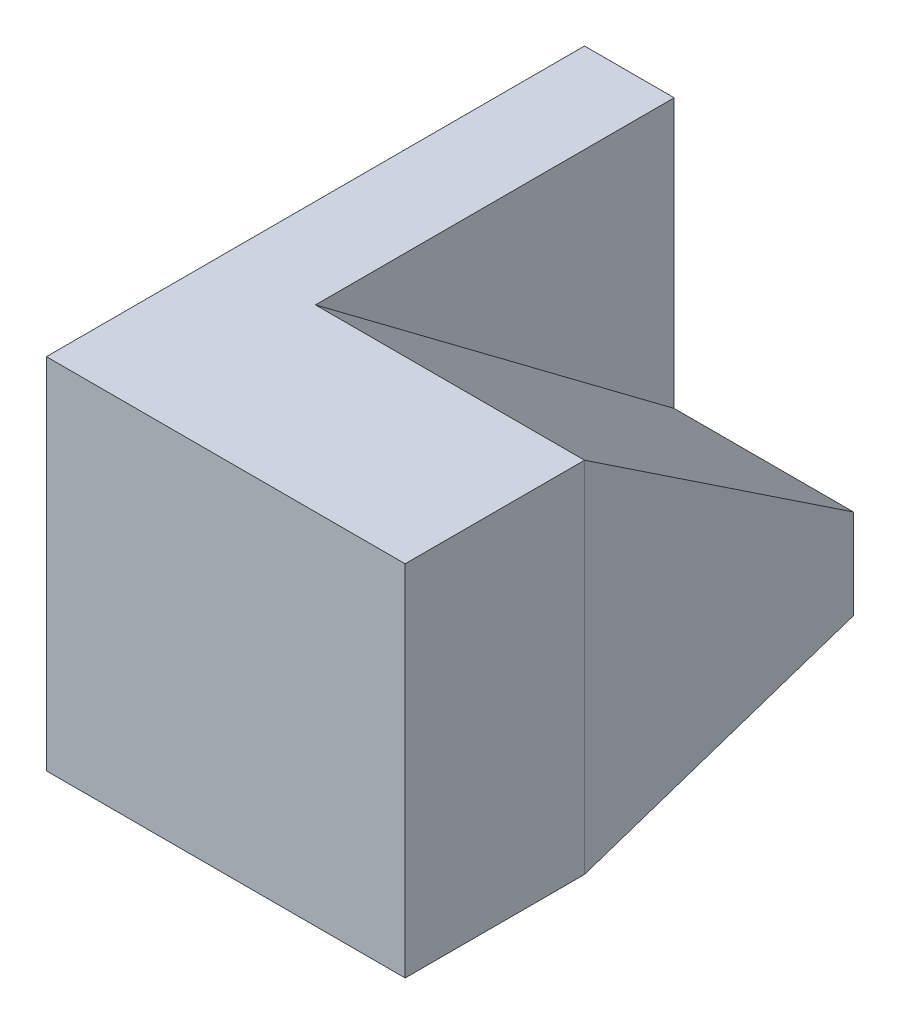
ISO-10303-21;
HEADER;
FILE_DESCRIPTION(('STEP AP214'),'2;1');
FILE_NAME('part.step','',(''),(''),'','','');
FILE_SCHEMA(('AUTOMOTIVE_DESIGN { 1 0 10303 214 1 1 1 1 }'));
ENDSEC;
DATA;
#1=APPLICATION_CONTEXT('core data for automotive mechanical design processes');
#2=APPLICATION_PROTOCOL_DEFINITION('international standard','automotive_design',2000,#1);
#3=PRODUCT_CONTEXT('',#1,'mechanical');
#4=PRODUCT('Part','Part','',(#3));
#5=PRODUCT_RELATED_PRODUCT_CATEGORY('part','',(#4));
#6=PRODUCT_DEFINITION_FORMATION('','',#4);
#7=PRODUCT_DEFINITION_CONTEXT('part definition',#1,'design');
#8=PRODUCT_DEFINITION('design','',#6,#7);
#9=PRODUCT_DEFINITION_SHAPE('','',#8);
#10=(LENGTH_UNIT() NAMED_UNIT(*) SI_UNIT(.MILLI.,.METRE.));
#11=(NAMED_UNIT(*) PLANE_ANGLE_UNIT() SI_UNIT($,.RADIAN.));
#12=(NAMED_UNIT(*) SI_UNIT($,.STERADIAN.) SOLID_ANGLE_UNIT());
#13=UNCERTAINTY_MEASURE_WITH_UNIT(LENGTH_MEASURE(1.E-05),#10,'distance_accuracy_value','');
#14=(GEOMETRIC_REPRESENTATION_CONTEXT(3) GLOBAL_UNCERTAINTY_ASSIGNED_CONTEXT((#13)) GLOBAL_UNIT_ASSIGNED_CONTEXT((#10,
#11,#12)) REPRESENTATION_CONTEXT('',''));
#15=CARTESIAN_POINT('',(0.,0.,0.));
#16=DIRECTION('',(0.,0.,1.));
#17=DIRECTION('',(1.,0.,0.));
#18=AXIS2_PLACEMENT_3D('',#15,#16,#17);
#19=CARTESIAN_POINT('',(30.,-40.,0.));
#20=DIRECTION('',(-0.970142500145332,0.,0.242535625036333));
#21=DIRECTION('',(0.242535625036333,0.,0.970142500145332));
#22=AXIS2_PLACEMENT_3D('',#19,#20,#21);
#23=PLANE('',#22);
#24=DIRECTION('',(-0.196116135138183,-0.588348405414552,-0.784464540552736));
#25=VECTOR('',#24,1.);
#26=CARTESIAN_POINT('',(41.0625097334401,3.18752920032047,44.2500389337607));
#27=LINE('',#26,#25);
#28=CARTESIAN_POINT('',(40.,0.,40.));
#29=VERTEX_POINT('',#28);
#30=CARTESIAN_POINT('',(29.9999999999999,-30.,0.));
#31=VERTEX_POINT('',#30);
#32=EDGE_CURVE('E150',#29,#31,#27,.T.);
#33=ORIENTED_EDGE('',*,*,#32,.F.);
#34=DIRECTION('',(0.,1.,0.));
#35=VECTOR('',#34,1.);
#36=CARTESIAN_POINT('',(40.,-40.,40.));
#37=LINE('',#36,#35);
#38=CARTESIAN_POINT('',(40.,-40.,40.));
#39=VERTEX_POINT('',#38);
#40=EDGE_CURVE('E110',#39,#29,#37,.T.);
#41=ORIENTED_EDGE('',*,*,#40,.F.);
#42=DIRECTION('',(0.242535625036333,0.,0.970142500145332));
#43=VECTOR('',#42,1.);
#44=CARTESIAN_POINT('',(30.,-40.,0.));
#45=LINE('',#44,#43);
#46=CARTESIAN_POINT('',(30.,-40.,0.));
#47=VERTEX_POINT('',#46);
#48=EDGE_CURVE('E142',#47,#39,#45,.T.);
#49=ORIENTED_EDGE('',*,*,#48,.F.);
#50=DIRECTION('',(0.,1.,0.));
#51=VECTOR('',#50,1.);
#52=CARTESIAN_POINT('',(30.,-40.,0.));
#53=LINE('',#52,#51);
#54=EDGE_CURVE('E115',#47,#31,#53,.T.);
#55=ORIENTED_EDGE('',*,*,#54,.T.);
#56=EDGE_LOOP('',(#33,#41,#49,#55));
#57=FACE_BOUND('',#56,.T.);
#58=ADVANCED_FACE('F33',(#57),#23,.F.);
#59=CARTESIAN_POINT('',(40.,0.,0.));
#60=DIRECTION('',(0.,0.,1.));
#61=DIRECTION('',(1.,0.,0.));
#62=AXIS2_PLACEMENT_3D('',#59,#60,#61);
#63=PLANE('',#62);
#64=DIRECTION('',(-1.,0.,0.));
#65=VECTOR('',#64,1.);
#66=CARTESIAN_POINT('',(40.,0.,0.));
#67=LINE('',#66,#65);
#68=CARTESIAN_POINT('',(9.99999999999991,0.,0.));
#69=VERTEX_POINT('',#68);
#70=CARTESIAN_POINT('',(0.,0.,0.));
#71=VERTEX_POINT('',#70);
#72=EDGE_CURVE('E11',#69,#71,#67,.T.);
#73=ORIENTED_EDGE('',*,*,#72,.F.);
#74=DIRECTION('',(0.,1.,0.));
#75=VECTOR('',#74,1.);
#76=CARTESIAN_POINT('',(9.99999999999991,-61.3849382881988,0.));
#77=LINE('',#76,#75);
#78=CARTESIAN_POINT('',(9.99999999999991,-30.,0.));
#79=VERTEX_POINT('',#78);
#80=EDGE_CURVE('E87',#79,#69,#77,.T.);
#81=ORIENTED_EDGE('',*,*,#80,.F.);
#82=DIRECTION('',(1.,0.,0.));
#83=VECTOR('',#82,1.);
#84=CARTESIAN_POINT('',(41.0625097334401,-30.,0.));
#85=LINE('',#84,#83);
#86=EDGE_CURVE('E99',#79,#31,#85,.T.);
#87=ORIENTED_EDGE('',*,*,#86,.T.);
#88=ORIENTED_EDGE('',*,*,#54,.F.);
#89=DIRECTION('',(-1.,0.,0.));
#90=VECTOR('',#89,1.);
#91=CARTESIAN_POINT('',(40.,-40.,0.));
#92=LINE('',#91,#90);
#93=CARTESIAN_POINT('',(0.,-40.,0.));
#94=VERTEX_POINT('',#93);
#95=EDGE_CURVE('E105',#47,#94,#92,.T.);
#96=ORIENTED_EDGE('',*,*,#95,.T.);
#97=DIRECTION('',(0.,1.,0.));
#98=VECTOR('',#97,1.);
#99=CARTESIAN_POINT('',(0.,0.,0.));
#100=LINE('',#99,#98);
#101=EDGE_CURVE('E102',#94,#71,#100,.T.);
#102=ORIENTED_EDGE('',*,*,#101,.T.);
#103=EDGE_LOOP('',(#73,#81,#87,#88,#96,#102));
#104=FACE_BOUND('',#103,.T.);
#105=ADVANCED_FACE('F35',(#104),#63,.F.);
#106=CARTESIAN_POINT('',(40.,0.,0.));
#107=DIRECTION('',(0.,-1.,0.));
#108=DIRECTION('',(0.,0.,-1.));
#109=AXIS2_PLACEMENT_3D('',#106,#107,#108);
#110=PLANE('',#109);
#111=DIRECTION('',(0.,0.,1.));
#112=VECTOR('',#111,1.);
#113=CARTESIAN_POINT('',(0.,0.,0.));
#114=LINE('',#113,#112);
#115=CARTESIAN_POINT('',(0.,0.,60.));
#116=VERTEX_POINT('',#115);
#117=EDGE_CURVE('E109',#71,#116,#114,.T.);
#118=ORIENTED_EDGE('',*,*,#117,.T.);
#119=DIRECTION('',(-1.,0.,0.));
#120=VECTOR('',#119,1.);
#121=CARTESIAN_POINT('',(40.,0.,60.));
#122=LINE('',#121,#120);
#123=CARTESIAN_POINT('',(40.,0.,60.));
#124=VERTEX_POINT('',#123);
#125=EDGE_CURVE('E41',#124,#116,#122,.T.);
#126=ORIENTED_EDGE('',*,*,#125,.F.);
#127=DIRECTION('',(0.,0.,1.));
#128=VECTOR('',#127,1.);
#129=CARTESIAN_POINT('',(40.,0.,0.));
#130=LINE('',#129,#128);
#131=EDGE_CURVE('E124',#29,#124,#130,.T.);
#132=ORIENTED_EDGE('',*,*,#131,.F.);
#133=DIRECTION('',(-1.,0.,0.));
#134=VECTOR('',#133,1.);
#135=CARTESIAN_POINT('',(41.0625097334401,0.,40.0000000000001));
#136=LINE('',#135,#134);
#137=CARTESIAN_POINT('',(9.99999999999992,0.,40.0000000000001));
#138=VERTEX_POINT('',#137);
#139=EDGE_CURVE('E55',#29,#138,#136,.T.);
#140=ORIENTED_EDGE('',*,*,#139,.T.);
#141=DIRECTION('',(0.,0.,-1.));
#142=VECTOR('',#141,1.);
#143=CARTESIAN_POINT('',(9.99999999999992,0.,4.25003893376071));
#144=LINE('',#143,#142);
#145=EDGE_CURVE('E90',#138,#69,#144,.T.);
#146=ORIENTED_EDGE('',*,*,#145,.T.);
#147=ORIENTED_EDGE('',*,*,#72,.T.);
#148=EDGE_LOOP('',(#118,#126,#132,#140,#146,#147));
#149=FACE_BOUND('',#148,.T.);
#150=ADVANCED_FACE('F96',(#149),#110,.F.);
#151=CARTESIAN_POINT('',(40.,0.,60.));
#152=DIRECTION('',(0.,0.,-1.));
#153=DIRECTION('',(0.,1.,0.));
#154=AXIS2_PLACEMENT_3D('',#151,#152,#153);
#155=PLANE('',#154);
#156=DIRECTION('',(0.,-1.,0.));
#157=VECTOR('',#156,1.);
#158=CARTESIAN_POINT('',(0.,0.,60.));
#159=LINE('',#158,#157);
#160=CARTESIAN_POINT('',(0.,-40.,60.));
#161=VERTEX_POINT('',#160);
#162=EDGE_CURVE('E112',#116,#161,#159,.T.);
#163=ORIENTED_EDGE('',*,*,#162,.T.);
#164=DIRECTION('',(-1.,0.,0.));
#165=VECTOR('',#164,1.);
#166=CARTESIAN_POINT('',(40.,-40.,60.));
#167=LINE('',#166,#165);
#168=CARTESIAN_POINT('',(40.,-40.,60.));
#169=VERTEX_POINT('',#168);
#170=EDGE_CURVE('E126',#169,#161,#167,.T.);
#171=ORIENTED_EDGE('',*,*,#170,.F.);
#172=DIRECTION('',(0.,-1.,0.));
#173=VECTOR('',#172,1.);
#174=CARTESIAN_POINT('',(40.,0.,60.));
#175=LINE('',#174,#173);
#176=EDGE_CURVE('E135',#124,#169,#175,.T.);
#177=ORIENTED_EDGE('',*,*,#176,.F.);
#178=ORIENTED_EDGE('',*,*,#125,.T.);
#179=EDGE_LOOP('',(#163,#171,#177,#178));
#180=FACE_BOUND('',#179,.T.);
#181=ADVANCED_FACE('F133',(#180),#155,.F.);
#182=CARTESIAN_POINT('',(40.,-40.,0.));
#183=DIRECTION('',(0.,1.,0.));
#184=DIRECTION('',(0.,0.,1.));
#185=AXIS2_PLACEMENT_3D('',#182,#183,#184);
#186=PLANE('',#185);
#187=ORIENTED_EDGE('',*,*,#95,.F.);
#188=ORIENTED_EDGE('',*,*,#48,.T.);
#189=DIRECTION('',(0.,0.,-1.));
#190=VECTOR('',#189,1.);
#191=CARTESIAN_POINT('',(40.,-40.,0.));
#192=LINE('',#191,#190);
#193=EDGE_CURVE('E118',#169,#39,#192,.T.);
#194=ORIENTED_EDGE('',*,*,#193,.F.);
#195=ORIENTED_EDGE('',*,*,#170,.T.);
#196=DIRECTION('',(0.,0.,-1.));
#197=VECTOR('',#196,1.);
#198=CARTESIAN_POINT('',(0.,-40.,0.));
#199=LINE('',#198,#197);
#200=EDGE_CURVE('E122',#161,#94,#199,.T.);
#201=ORIENTED_EDGE('',*,*,#200,.T.);
#202=EDGE_LOOP('',(#187,#188,#194,#195,#201));
#203=FACE_BOUND('',#202,.T.);
#204=ADVANCED_FACE('F138',(#203),#186,.F.);
#205=CARTESIAN_POINT('',(40.,0.,0.));
#206=DIRECTION('',(-1.,0.,0.));
#207=DIRECTION('',(0.,0.,1.));
#208=AXIS2_PLACEMENT_3D('',#205,#206,#207);
#209=PLANE('',#208);
#210=ORIENTED_EDGE('',*,*,#193,.T.);
#211=ORIENTED_EDGE('',*,*,#40,.T.);
#212=ORIENTED_EDGE('',*,*,#131,.T.);
#213=ORIENTED_EDGE('',*,*,#176,.T.);
#214=EDGE_LOOP('',(#210,#211,#212,#213));
#215=FACE_BOUND('',#214,.T.);
#216=ADVANCED_FACE('F155',(#215),#209,.F.);
#217=CARTESIAN_POINT('',(0.,0.,0.));
#218=DIRECTION('',(-1.,0.,0.));
#219=DIRECTION('',(0.,0.,1.));
#220=AXIS2_PLACEMENT_3D('',#217,#218,#219);
#221=PLANE('',#220);
#222=ORIENTED_EDGE('',*,*,#117,.F.);
#223=ORIENTED_EDGE('',*,*,#101,.F.);
#224=ORIENTED_EDGE('',*,*,#200,.F.);
#225=ORIENTED_EDGE('',*,*,#162,.F.);
#226=EDGE_LOOP('',(#222,#223,#224,#225));
#227=FACE_BOUND('',#226,.T.);
#228=ADVANCED_FACE('F136',(#227),#221,.T.);
#229=CARTESIAN_POINT('',(41.0625097334401,3.18752920032047,44.2500389337607));
#230=DIRECTION('',(0.,0.8,-0.6));
#231=DIRECTION('',(0.,0.6,0.8));
#232=AXIS2_PLACEMENT_3D('',#229,#230,#231);
#233=PLANE('',#232);
#234=DIRECTION('',(0.,0.6,0.8));
#235=VECTOR('',#234,1.);
#236=CARTESIAN_POINT('',(9.99999999999992,-22.0985777837515,10.5352296216647));
#237=LINE('',#236,#235);
#238=EDGE_CURVE('E48',#79,#138,#237,.T.);
#239=ORIENTED_EDGE('',*,*,#238,.T.);
#240=ORIENTED_EDGE('',*,*,#139,.F.);
#241=ORIENTED_EDGE('',*,*,#32,.T.);
#242=ORIENTED_EDGE('',*,*,#86,.F.);
#243=EDGE_LOOP('',(#239,#240,#241,#242));
#244=FACE_BOUND('',#243,.T.);
#245=ADVANCED_FACE('F153',(#244),#233,.T.);
#246=CARTESIAN_POINT('',(9.99999999999992,-61.3849382881988,40.0000000000001));
#247=DIRECTION('',(1.,0.,0.));
#248=DIRECTION('',(0.,0.,-1.));
#249=AXIS2_PLACEMENT_3D('',#246,#247,#248);
#250=PLANE('',#249);
#251=ORIENTED_EDGE('',*,*,#238,.F.);
#252=ORIENTED_EDGE('',*,*,#80,.T.);
#253=ORIENTED_EDGE('',*,*,#145,.F.);
#254=EDGE_LOOP('',(#251,#252,#253));
#255=FACE_BOUND('',#254,.T.);
#256=ADVANCED_FACE('F89',(#255),#250,.T.);
#257=CLOSED_SHELL('',(#58,#105,#150,#181,#204,#216,#228,#245,#256));
#258=MANIFOLD_SOLID_BREP('B2',#257);
#259=ADVANCED_BREP_SHAPE_REPRESENTATION('',(#18,#258),#14);
#260=SHAPE_DEFINITION_REPRESENTATION(#9,#259);
ENDSEC;
END-ISO-10303-21;
